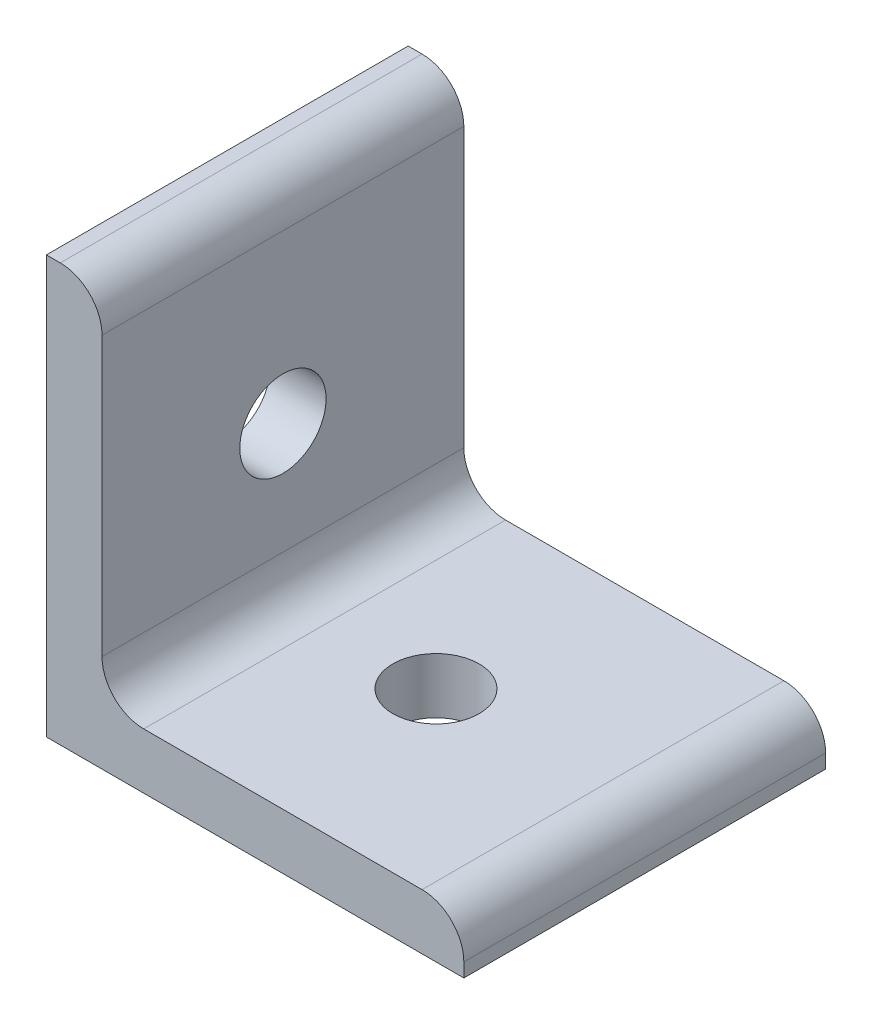
ISO-10303-21;
HEADER;
FILE_DESCRIPTION(('STEP AP214'),'2;1');
FILE_NAME('part.step','',(''),(''),'','','');
FILE_SCHEMA(('AUTOMOTIVE_DESIGN { 1 0 10303 214 1 1 1 1 }'));
ENDSEC;
DATA;
#1=APPLICATION_CONTEXT('core data for automotive mechanical design processes');
#2=APPLICATION_PROTOCOL_DEFINITION('international standard','automotive_design',2000,#1);
#3=PRODUCT_CONTEXT('',#1,'mechanical');
#4=PRODUCT('Part','Part','',(#3));
#5=PRODUCT_RELATED_PRODUCT_CATEGORY('part','',(#4));
#6=PRODUCT_DEFINITION_FORMATION('','',#4);
#7=PRODUCT_DEFINITION_CONTEXT('part definition',#1,'design');
#8=PRODUCT_DEFINITION('design','',#6,#7);
#9=PRODUCT_DEFINITION_SHAPE('','',#8);
#10=(LENGTH_UNIT() NAMED_UNIT(*) SI_UNIT(.MILLI.,.METRE.));
#11=(NAMED_UNIT(*) PLANE_ANGLE_UNIT() SI_UNIT($,.RADIAN.));
#12=(NAMED_UNIT(*) SI_UNIT($,.STERADIAN.) SOLID_ANGLE_UNIT());
#13=UNCERTAINTY_MEASURE_WITH_UNIT(LENGTH_MEASURE(1.E-05),#10,'distance_accuracy_value','');
#14=(GEOMETRIC_REPRESENTATION_CONTEXT(3) GLOBAL_UNCERTAINTY_ASSIGNED_CONTEXT((#13)) GLOBAL_UNIT_ASSIGNED_CONTEXT((#10,
#11,#12)) REPRESENTATION_CONTEXT('',''));
#15=CARTESIAN_POINT('',(0.,0.,0.));
#16=DIRECTION('',(0.,0.,1.));
#17=DIRECTION('',(1.,0.,0.));
#18=AXIS2_PLACEMENT_3D('',#15,#16,#17);
#19=CARTESIAN_POINT('',(0.,30.,13.));
#20=DIRECTION('',(1.,0.,0.));
#21=DIRECTION('',(0.,1.,0.));
#22=AXIS2_PLACEMENT_3D('',#19,#20,#21);
#23=PLANE('',#22);
#24=CARTESIAN_POINT('',(0.,15.,0.));
#25=DIRECTION('',(1.,0.,0.));
#26=DIRECTION('',(0.,0.,-1.));
#27=AXIS2_PLACEMENT_3D('',#24,#25,#26);
#28=CIRCLE('',#27,3.1);
#29=CARTESIAN_POINT('',(0.,15.,-3.1));
#30=VERTEX_POINT('',#29);
#31=EDGE_CURVE('E235',#30,#30,#28,.T.);
#32=ORIENTED_EDGE('',*,*,#31,.T.);
#33=EDGE_LOOP('',(#32));
#34=FACE_BOUND('',#33,.T.);
#35=DIRECTION('',(0.,-1.,0.));
#36=VECTOR('',#35,1.);
#37=CARTESIAN_POINT('',(0.,30.,-13.));
#38=LINE('',#37,#36);
#39=CARTESIAN_POINT('',(0.,30.,-13.));
#40=VERTEX_POINT('',#39);
#41=CARTESIAN_POINT('',(0.,0.,-13.));
#42=VERTEX_POINT('',#41);
#43=EDGE_CURVE('E135',#40,#42,#38,.T.);
#44=ORIENTED_EDGE('',*,*,#43,.T.);
#45=DIRECTION('',(0.,0.,-1.));
#46=VECTOR('',#45,1.);
#47=CARTESIAN_POINT('',(0.,0.,13.));
#48=LINE('',#47,#46);
#49=CARTESIAN_POINT('',(0.,0.,13.));
#50=VERTEX_POINT('',#49);
#51=EDGE_CURVE('E117',#50,#42,#48,.T.);
#52=ORIENTED_EDGE('',*,*,#51,.F.);
#53=DIRECTION('',(0.,-1.,0.));
#54=VECTOR('',#53,1.);
#55=CARTESIAN_POINT('',(0.,30.,13.));
#56=LINE('',#55,#54);
#57=CARTESIAN_POINT('',(0.,30.,13.));
#58=VERTEX_POINT('',#57);
#59=EDGE_CURVE('E123',#58,#50,#56,.T.);
#60=ORIENTED_EDGE('',*,*,#59,.F.);
#61=DIRECTION('',(0.,0.,-1.));
#62=VECTOR('',#61,1.);
#63=CARTESIAN_POINT('',(0.,30.,13.));
#64=LINE('',#63,#62);
#65=EDGE_CURVE('E143',#58,#40,#64,.T.);
#66=ORIENTED_EDGE('',*,*,#65,.T.);
#67=EDGE_LOOP('',(#44,#52,#60,#66));
#68=FACE_BOUND('',#67,.T.);
#69=ADVANCED_FACE('F39',(#34,#68),#23,.F.);
#70=CARTESIAN_POINT('',(0.,0.,13.));
#71=DIRECTION('',(0.,1.,0.));
#72=DIRECTION('',(0.,0.,1.));
#73=AXIS2_PLACEMENT_3D('',#70,#71,#72);
#74=PLANE('',#73);
#75=CARTESIAN_POINT('',(15.,0.,0.));
#76=DIRECTION('',(0.,1.,0.));
#77=DIRECTION('',(0.,0.,1.));
#78=AXIS2_PLACEMENT_3D('',#75,#76,#77);
#79=CIRCLE('',#78,3.1);
#80=CARTESIAN_POINT('',(15.,0.,3.1));
#81=VERTEX_POINT('',#80);
#82=EDGE_CURVE('E212',#81,#81,#79,.T.);
#83=ORIENTED_EDGE('',*,*,#82,.T.);
#84=EDGE_LOOP('',(#83));
#85=FACE_BOUND('',#84,.T.);
#86=DIRECTION('',(1.,0.,0.));
#87=VECTOR('',#86,1.);
#88=CARTESIAN_POINT('',(0.,0.,-13.));
#89=LINE('',#88,#87);
#90=CARTESIAN_POINT('',(30.,0.,-13.));
#91=VERTEX_POINT('',#90);
#92=EDGE_CURVE('E211',#42,#91,#89,.T.);
#93=ORIENTED_EDGE('',*,*,#92,.T.);
#94=DIRECTION('',(0.,0.,-1.));
#95=VECTOR('',#94,1.);
#96=CARTESIAN_POINT('',(30.,0.,13.));
#97=LINE('',#96,#95);
#98=CARTESIAN_POINT('',(30.,0.,13.));
#99=VERTEX_POINT('',#98);
#100=EDGE_CURVE('E120',#99,#91,#97,.T.);
#101=ORIENTED_EDGE('',*,*,#100,.F.);
#102=DIRECTION('',(1.,0.,0.));
#103=VECTOR('',#102,1.);
#104=CARTESIAN_POINT('',(0.,0.,13.));
#105=LINE('',#104,#103);
#106=EDGE_CURVE('E113',#50,#99,#105,.T.);
#107=ORIENTED_EDGE('',*,*,#106,.F.);
#108=ORIENTED_EDGE('',*,*,#51,.T.);
#109=EDGE_LOOP('',(#93,#101,#107,#108));
#110=FACE_BOUND('',#109,.T.);
#111=ADVANCED_FACE('F115',(#85,#110),#74,.F.);
#112=CARTESIAN_POINT('',(30.,0.,13.));
#113=DIRECTION('',(-1.,0.,0.));
#114=DIRECTION('',(0.,0.,1.));
#115=AXIS2_PLACEMENT_3D('',#112,#113,#114);
#116=PLANE('',#115);
#117=DIRECTION('',(0.,1.,0.));
#118=VECTOR('',#117,1.);
#119=CARTESIAN_POINT('',(30.,0.,-13.));
#120=LINE('',#119,#118);
#121=CARTESIAN_POINT('',(30.,1.,-13.));
#122=VERTEX_POINT('',#121);
#123=EDGE_CURVE('E191',#91,#122,#120,.T.);
#124=ORIENTED_EDGE('',*,*,#123,.T.);
#125=DIRECTION('',(0.,0.,-1.));
#126=VECTOR('',#125,1.);
#127=CARTESIAN_POINT('',(30.,1.,13.));
#128=LINE('',#127,#126);
#129=CARTESIAN_POINT('',(30.,1.,13.));
#130=VERTEX_POINT('',#129);
#131=EDGE_CURVE('E63',#122,#130,#128,.F.);
#132=ORIENTED_EDGE('',*,*,#131,.T.);
#133=DIRECTION('',(0.,1.,0.));
#134=VECTOR('',#133,1.);
#135=CARTESIAN_POINT('',(30.,0.,13.));
#136=LINE('',#135,#134);
#137=EDGE_CURVE('E122',#99,#130,#136,.T.);
#138=ORIENTED_EDGE('',*,*,#137,.F.);
#139=ORIENTED_EDGE('',*,*,#100,.T.);
#140=EDGE_LOOP('',(#124,#132,#138,#139));
#141=FACE_BOUND('',#140,.T.);
#142=ADVANCED_FACE('F224',(#141),#116,.F.);
#143=CARTESIAN_POINT('',(30.,4.,13.));
#144=DIRECTION('',(0.,-1.,0.));
#145=DIRECTION('',(1.,0.,0.));
#146=AXIS2_PLACEMENT_3D('',#143,#144,#145);
#147=PLANE('',#146);
#148=CARTESIAN_POINT('',(15.,4.,0.));
#149=DIRECTION('',(0.,1.,0.));
#150=DIRECTION('',(0.,0.,1.));
#151=AXIS2_PLACEMENT_3D('',#148,#149,#150);
#152=CIRCLE('',#151,3.09999999999999);
#153=CARTESIAN_POINT('',(15.,4.,3.09999999999999));
#154=VERTEX_POINT('',#153);
#155=EDGE_CURVE('E231',#154,#154,#152,.T.);
#156=ORIENTED_EDGE('',*,*,#155,.F.);
#157=EDGE_LOOP('',(#156));
#158=FACE_BOUND('',#157,.T.);
#159=DIRECTION('',(-1.,0.,0.));
#160=VECTOR('',#159,1.);
#161=CARTESIAN_POINT('',(30.,4.,-13.));
#162=LINE('',#161,#160);
#163=CARTESIAN_POINT('',(27.,4.,-13.));
#164=VERTEX_POINT('',#163);
#165=CARTESIAN_POINT('',(7.00000000000001,4.,-13.));
#166=VERTEX_POINT('',#165);
#167=EDGE_CURVE('E179',#164,#166,#162,.T.);
#168=ORIENTED_EDGE('',*,*,#167,.T.);
#169=DIRECTION('',(0.,0.,-1.));
#170=VECTOR('',#169,1.);
#171=CARTESIAN_POINT('',(7.,4.,13.));
#172=LINE('',#171,#170);
#173=CARTESIAN_POINT('',(7.00000000000001,4.,13.));
#174=VERTEX_POINT('',#173);
#175=EDGE_CURVE('E154',#166,#174,#172,.F.);
#176=ORIENTED_EDGE('',*,*,#175,.T.);
#177=DIRECTION('',(-1.,0.,0.));
#178=VECTOR('',#177,1.);
#179=CARTESIAN_POINT('',(30.,4.,13.));
#180=LINE('',#179,#178);
#181=CARTESIAN_POINT('',(27.,4.,13.));
#182=VERTEX_POINT('',#181);
#183=EDGE_CURVE('E197',#182,#174,#180,.T.);
#184=ORIENTED_EDGE('',*,*,#183,.F.);
#185=DIRECTION('',(0.,0.,-1.));
#186=VECTOR('',#185,1.);
#187=CARTESIAN_POINT('',(27.,4.,13.));
#188=LINE('',#187,#186);
#189=EDGE_CURVE('E150',#182,#164,#188,.T.);
#190=ORIENTED_EDGE('',*,*,#189,.T.);
#191=EDGE_LOOP('',(#168,#176,#184,#190));
#192=FACE_BOUND('',#191,.T.);
#193=ADVANCED_FACE('F186',(#158,#192),#147,.F.);
#194=CARTESIAN_POINT('',(4.,4.,13.));
#195=DIRECTION('',(-1.,0.,0.));
#196=DIRECTION('',(0.,0.,1.));
#197=AXIS2_PLACEMENT_3D('',#194,#195,#196);
#198=PLANE('',#197);
#199=CARTESIAN_POINT('',(4.,15.,0.));
#200=DIRECTION('',(1.,0.,0.));
#201=DIRECTION('',(0.,0.,-1.));
#202=AXIS2_PLACEMENT_3D('',#199,#200,#201);
#203=CIRCLE('',#202,3.09999999999999);
#204=CARTESIAN_POINT('',(4.,15.,-3.09999999999999));
#205=VERTEX_POINT('',#204);
#206=EDGE_CURVE('E239',#205,#205,#203,.T.);
#207=ORIENTED_EDGE('',*,*,#206,.F.);
#208=EDGE_LOOP('',(#207));
#209=FACE_BOUND('',#208,.T.);
#210=DIRECTION('',(0.,1.,0.));
#211=VECTOR('',#210,1.);
#212=CARTESIAN_POINT('',(4.,4.,13.));
#213=LINE('',#212,#211);
#214=CARTESIAN_POINT('',(4.,7.,13.));
#215=VERTEX_POINT('',#214);
#216=CARTESIAN_POINT('',(4.,27.,13.));
#217=VERTEX_POINT('',#216);
#218=EDGE_CURVE('E196',#215,#217,#213,.T.);
#219=ORIENTED_EDGE('',*,*,#218,.F.);
#220=DIRECTION('',(0.,0.,-1.));
#221=VECTOR('',#220,1.);
#222=CARTESIAN_POINT('',(4.,7.,-13.));
#223=LINE('',#222,#221);
#224=CARTESIAN_POINT('',(4.,7.,-13.));
#225=VERTEX_POINT('',#224);
#226=EDGE_CURVE('E141',#215,#225,#223,.T.);
#227=ORIENTED_EDGE('',*,*,#226,.T.);
#228=DIRECTION('',(0.,1.,0.));
#229=VECTOR('',#228,1.);
#230=CARTESIAN_POINT('',(4.,4.,-13.));
#231=LINE('',#230,#229);
#232=CARTESIAN_POINT('',(4.,27.,-13.));
#233=VERTEX_POINT('',#232);
#234=EDGE_CURVE('E181',#225,#233,#231,.T.);
#235=ORIENTED_EDGE('',*,*,#234,.T.);
#236=DIRECTION('',(0.,0.,-1.));
#237=VECTOR('',#236,1.);
#238=CARTESIAN_POINT('',(4.,27.,13.));
#239=LINE('',#238,#237);
#240=EDGE_CURVE('E137',#233,#217,#239,.F.);
#241=ORIENTED_EDGE('',*,*,#240,.T.);
#242=EDGE_LOOP('',(#219,#227,#235,#241));
#243=FACE_BOUND('',#242,.T.);
#244=ADVANCED_FACE('F199',(#209,#243),#198,.F.);
#245=CARTESIAN_POINT('',(4.,30.,13.));
#246=DIRECTION('',(0.,-1.,0.));
#247=DIRECTION('',(0.,0.,-1.));
#248=AXIS2_PLACEMENT_3D('',#245,#246,#247);
#249=PLANE('',#248);
#250=DIRECTION('',(-1.,0.,0.));
#251=VECTOR('',#250,1.);
#252=CARTESIAN_POINT('',(4.,30.,13.));
#253=LINE('',#252,#251);
#254=CARTESIAN_POINT('',(1.,30.,13.));
#255=VERTEX_POINT('',#254);
#256=EDGE_CURVE('E127',#255,#58,#253,.T.);
#257=ORIENTED_EDGE('',*,*,#256,.F.);
#258=DIRECTION('',(0.,0.,-1.));
#259=VECTOR('',#258,1.);
#260=CARTESIAN_POINT('',(1.,30.,13.));
#261=LINE('',#260,#259);
#262=CARTESIAN_POINT('',(1.,30.,-13.));
#263=VERTEX_POINT('',#262);
#264=EDGE_CURVE('E170',#255,#263,#261,.T.);
#265=ORIENTED_EDGE('',*,*,#264,.T.);
#266=DIRECTION('',(-1.,0.,0.));
#267=VECTOR('',#266,1.);
#268=CARTESIAN_POINT('',(4.,30.,-13.));
#269=LINE('',#268,#267);
#270=EDGE_CURVE('E132',#263,#40,#269,.T.);
#271=ORIENTED_EDGE('',*,*,#270,.T.);
#272=ORIENTED_EDGE('',*,*,#65,.F.);
#273=EDGE_LOOP('',(#257,#265,#271,#272));
#274=FACE_BOUND('',#273,.T.);
#275=ADVANCED_FACE('F247',(#274),#249,.F.);
#276=CARTESIAN_POINT('',(0.,0.,13.));
#277=DIRECTION('',(0.,0.,1.));
#278=DIRECTION('',(1.,0.,0.));
#279=AXIS2_PLACEMENT_3D('',#276,#277,#278);
#280=PLANE('',#279);
#281=ORIENTED_EDGE('',*,*,#137,.T.);
#282=CARTESIAN_POINT('',(27.,1.,13.));
#283=DIRECTION('',(0.,0.,1.));
#284=DIRECTION('',(1.,0.,0.));
#285=AXIS2_PLACEMENT_3D('',#282,#283,#284);
#286=CIRCLE('',#285,3.);
#287=EDGE_CURVE('E167',#130,#182,#286,.T.);
#288=ORIENTED_EDGE('',*,*,#287,.T.);
#289=ORIENTED_EDGE('',*,*,#183,.T.);
#290=CARTESIAN_POINT('',(7.,7.,13.));
#291=DIRECTION('',(0.,0.,1.));
#292=DIRECTION('',(1.,0.,0.));
#293=AXIS2_PLACEMENT_3D('',#290,#291,#292);
#294=CIRCLE('',#293,3.);
#295=EDGE_CURVE('E11',#174,#215,#294,.F.);
#296=ORIENTED_EDGE('',*,*,#295,.T.);
#297=ORIENTED_EDGE('',*,*,#218,.T.);
#298=CARTESIAN_POINT('',(1.,27.,13.));
#299=DIRECTION('',(0.,0.,1.));
#300=DIRECTION('',(1.,0.,0.));
#301=AXIS2_PLACEMENT_3D('',#298,#299,#300);
#302=CIRCLE('',#301,3.);
#303=EDGE_CURVE('E55',#217,#255,#302,.T.);
#304=ORIENTED_EDGE('',*,*,#303,.T.);
#305=ORIENTED_EDGE('',*,*,#256,.T.);
#306=ORIENTED_EDGE('',*,*,#59,.T.);
#307=ORIENTED_EDGE('',*,*,#106,.T.);
#308=EDGE_LOOP('',(#281,#288,#289,#296,#297,#304,#305,#306,#307));
#309=FACE_BOUND('',#308,.T.);
#310=ADVANCED_FACE('F126',(#309),#280,.T.);
#311=CARTESIAN_POINT('',(0.,0.,-13.));
#312=DIRECTION('',(0.,0.,1.));
#313=DIRECTION('',(1.,0.,0.));
#314=AXIS2_PLACEMENT_3D('',#311,#312,#313);
#315=PLANE('',#314);
#316=ORIENTED_EDGE('',*,*,#167,.F.);
#317=CARTESIAN_POINT('',(27.,1.,-13.));
#318=DIRECTION('',(0.,0.,1.));
#319=DIRECTION('',(1.,0.,0.));
#320=AXIS2_PLACEMENT_3D('',#317,#318,#319);
#321=CIRCLE('',#320,3.);
#322=EDGE_CURVE('E160',#164,#122,#321,.F.);
#323=ORIENTED_EDGE('',*,*,#322,.T.);
#324=ORIENTED_EDGE('',*,*,#123,.F.);
#325=ORIENTED_EDGE('',*,*,#92,.F.);
#326=ORIENTED_EDGE('',*,*,#43,.F.);
#327=ORIENTED_EDGE('',*,*,#270,.F.);
#328=CARTESIAN_POINT('',(1.,27.,-13.));
#329=DIRECTION('',(0.,0.,1.));
#330=DIRECTION('',(1.,0.,0.));
#331=AXIS2_PLACEMENT_3D('',#328,#329,#330);
#332=CIRCLE('',#331,3.);
#333=EDGE_CURVE('E157',#263,#233,#332,.F.);
#334=ORIENTED_EDGE('',*,*,#333,.T.);
#335=ORIENTED_EDGE('',*,*,#234,.F.);
#336=CARTESIAN_POINT('',(7.,7.,-13.));
#337=DIRECTION('',(0.,0.,1.));
#338=DIRECTION('',(1.,0.,0.));
#339=AXIS2_PLACEMENT_3D('',#336,#337,#338);
#340=CIRCLE('',#339,3.);
#341=EDGE_CURVE('E48',#225,#166,#340,.T.);
#342=ORIENTED_EDGE('',*,*,#341,.T.);
#343=EDGE_LOOP('',(#316,#323,#324,#325,#326,#327,#334,#335,#342));
#344=FACE_BOUND('',#343,.T.);
#345=ADVANCED_FACE('F178',(#344),#315,.F.);
#346=CARTESIAN_POINT('',(15.,4.,0.));
#347=DIRECTION('',(0.,1.,0.));
#348=DIRECTION('',(0.,0.,1.));
#349=AXIS2_PLACEMENT_3D('',#346,#347,#348);
#350=CYLINDRICAL_SURFACE('',#349,3.09999999999999);
#351=ORIENTED_EDGE('',*,*,#82,.F.);
#352=EDGE_LOOP('',(#351));
#353=FACE_BOUND('',#352,.T.);
#354=ORIENTED_EDGE('',*,*,#155,.T.);
#355=EDGE_LOOP('',(#354));
#356=FACE_BOUND('',#355,.T.);
#357=ADVANCED_FACE('F298',(#353,#356),#350,.F.);
#358=CARTESIAN_POINT('',(4.,15.,0.));
#359=DIRECTION('',(1.,0.,0.));
#360=DIRECTION('',(0.,0.,-1.));
#361=AXIS2_PLACEMENT_3D('',#358,#359,#360);
#362=CYLINDRICAL_SURFACE('',#361,3.09999999999999);
#363=ORIENTED_EDGE('',*,*,#31,.F.);
#364=EDGE_LOOP('',(#363));
#365=FACE_BOUND('',#364,.T.);
#366=ORIENTED_EDGE('',*,*,#206,.T.);
#367=EDGE_LOOP('',(#366));
#368=FACE_BOUND('',#367,.T.);
#369=ADVANCED_FACE('F244',(#365,#368),#362,.F.);
#370=CARTESIAN_POINT('',(7.,7.,13.));
#371=DIRECTION('',(0.,0.,1.));
#372=DIRECTION('',(1.,0.,0.));
#373=AXIS2_PLACEMENT_3D('',#370,#371,#372);
#374=CYLINDRICAL_SURFACE('',#373,3.);
#375=ORIENTED_EDGE('',*,*,#295,.F.);
#376=ORIENTED_EDGE('',*,*,#175,.F.);
#377=ORIENTED_EDGE('',*,*,#341,.F.);
#378=ORIENTED_EDGE('',*,*,#226,.F.);
#379=EDGE_LOOP('',(#375,#376,#377,#378));
#380=FACE_BOUND('',#379,.T.);
#381=ADVANCED_FACE('F194',(#380),#374,.F.);
#382=CARTESIAN_POINT('',(27.,1.,13.));
#383=DIRECTION('',(0.,0.,-1.));
#384=DIRECTION('',(-1.,0.,0.));
#385=AXIS2_PLACEMENT_3D('',#382,#383,#384);
#386=CYLINDRICAL_SURFACE('',#385,3.);
#387=ORIENTED_EDGE('',*,*,#287,.F.);
#388=ORIENTED_EDGE('',*,*,#131,.F.);
#389=ORIENTED_EDGE('',*,*,#322,.F.);
#390=ORIENTED_EDGE('',*,*,#189,.F.);
#391=EDGE_LOOP('',(#387,#388,#389,#390));
#392=FACE_BOUND('',#391,.T.);
#393=ADVANCED_FACE('F267',(#392),#386,.T.);
#394=CARTESIAN_POINT('',(1.,27.,13.));
#395=DIRECTION('',(0.,0.,-1.));
#396=DIRECTION('',(-1.,0.,0.));
#397=AXIS2_PLACEMENT_3D('',#394,#395,#396);
#398=CYLINDRICAL_SURFACE('',#397,3.);
#399=ORIENTED_EDGE('',*,*,#303,.F.);
#400=ORIENTED_EDGE('',*,*,#240,.F.);
#401=ORIENTED_EDGE('',*,*,#333,.F.);
#402=ORIENTED_EDGE('',*,*,#264,.F.);
#403=EDGE_LOOP('',(#399,#400,#401,#402));
#404=FACE_BOUND('',#403,.T.);
#405=ADVANCED_FACE('F41',(#404),#398,.T.);
#406=CLOSED_SHELL('',(#69,#111,#142,#193,#244,#275,#310,#345,#357,#369,#381,#393,#405));
#407=MANIFOLD_SOLID_BREP('B2',#406);
#408=ADVANCED_BREP_SHAPE_REPRESENTATION('',(#18,#407),#14);
#409=SHAPE_DEFINITION_REPRESENTATION(#9,#408);
ENDSEC;
END-ISO-10303-21;
